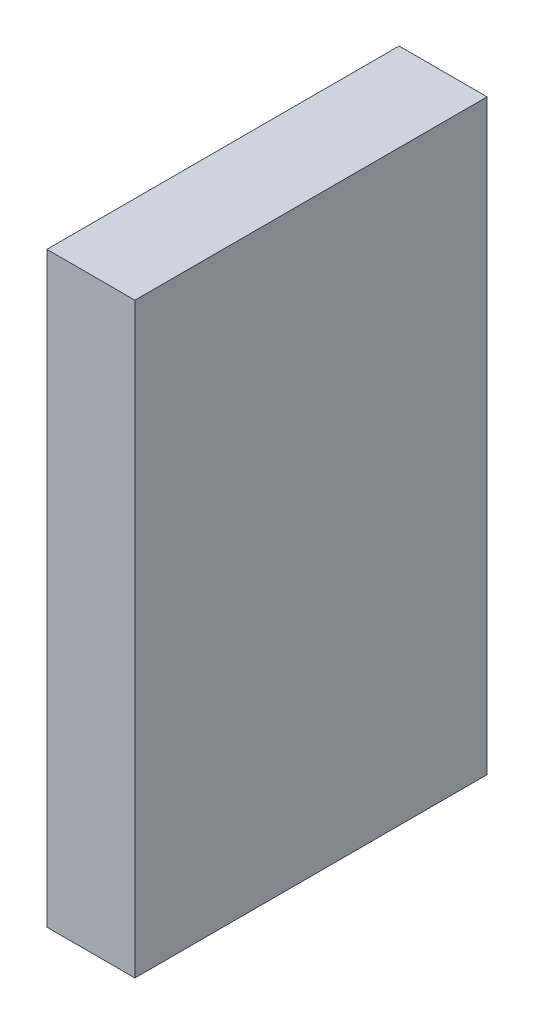
ISO-10303-21;
HEADER;
FILE_DESCRIPTION(('STEP AP214'),'2;1');
FILE_NAME('part.step','',(''),(''),'','','');
FILE_SCHEMA(('AUTOMOTIVE_DESIGN { 1 0 10303 214 1 1 1 1 }'));
ENDSEC;
DATA;
#1=APPLICATION_CONTEXT('core data for automotive mechanical design processes');
#2=APPLICATION_PROTOCOL_DEFINITION('international standard','automotive_design',2000,#1);
#3=PRODUCT_CONTEXT('',#1,'mechanical');
#4=PRODUCT('Part','Part','',(#3));
#5=PRODUCT_RELATED_PRODUCT_CATEGORY('part','',(#4));
#6=PRODUCT_DEFINITION_FORMATION('','',#4);
#7=PRODUCT_DEFINITION_CONTEXT('part definition',#1,'design');
#8=PRODUCT_DEFINITION('design','',#6,#7);
#9=PRODUCT_DEFINITION_SHAPE('','',#8);
#10=(LENGTH_UNIT() NAMED_UNIT(*) SI_UNIT(.MILLI.,.METRE.));
#11=(NAMED_UNIT(*) PLANE_ANGLE_UNIT() SI_UNIT($,.RADIAN.));
#12=(NAMED_UNIT(*) SI_UNIT($,.STERADIAN.) SOLID_ANGLE_UNIT());
#13=UNCERTAINTY_MEASURE_WITH_UNIT(LENGTH_MEASURE(1.E-05),#10,'distance_accuracy_value','');
#14=(GEOMETRIC_REPRESENTATION_CONTEXT(3) GLOBAL_UNCERTAINTY_ASSIGNED_CONTEXT((#13)) GLOBAL_UNIT_ASSIGNED_CONTEXT((#10,
#11,#12)) REPRESENTATION_CONTEXT('',''));
#15=CARTESIAN_POINT('',(0.,0.,0.));
#16=DIRECTION('',(0.,0.,1.));
#17=DIRECTION('',(1.,0.,0.));
#18=AXIS2_PLACEMENT_3D('',#15,#16,#17);
#19=CARTESIAN_POINT('',(0.,0.,60.));
#20=DIRECTION('',(1.,0.,0.));
#21=DIRECTION('',(0.,0.,-1.));
#22=AXIS2_PLACEMENT_3D('',#19,#20,#21);
#23=PLANE('',#22);
#24=DIRECTION('',(0.,-1.,0.));
#25=VECTOR('',#24,1.);
#26=CARTESIAN_POINT('',(0.,0.,0.));
#27=LINE('',#26,#25);
#28=CARTESIAN_POINT('',(0.,100.,0.));
#29=VERTEX_POINT('',#28);
#30=CARTESIAN_POINT('',(0.,0.,0.));
#31=VERTEX_POINT('',#30);
#32=EDGE_CURVE('E100',#29,#31,#27,.T.);
#33=ORIENTED_EDGE('',*,*,#32,.T.);
#34=DIRECTION('',(0.,0.,-1.));
#35=VECTOR('',#34,1.);
#36=CARTESIAN_POINT('',(0.,0.,60.));
#37=LINE('',#36,#35);
#38=CARTESIAN_POINT('',(0.,0.,60.));
#39=VERTEX_POINT('',#38);
#40=EDGE_CURVE('E11',#39,#31,#37,.T.);
#41=ORIENTED_EDGE('',*,*,#40,.F.);
#42=DIRECTION('',(0.,-1.,0.));
#43=VECTOR('',#42,1.);
#44=CARTESIAN_POINT('',(0.,0.,60.));
#45=LINE('',#44,#43);
#46=CARTESIAN_POINT('',(0.,100.,60.));
#47=VERTEX_POINT('',#46);
#48=EDGE_CURVE('E88',#47,#39,#45,.T.);
#49=ORIENTED_EDGE('',*,*,#48,.F.);
#50=DIRECTION('',(0.,0.,-1.));
#51=VECTOR('',#50,1.);
#52=CARTESIAN_POINT('',(0.,100.,60.));
#53=LINE('',#52,#51);
#54=EDGE_CURVE('E96',#47,#29,#53,.T.);
#55=ORIENTED_EDGE('',*,*,#54,.T.);
#56=EDGE_LOOP('',(#33,#41,#49,#55));
#57=FACE_BOUND('',#56,.T.);
#58=ADVANCED_FACE('F37',(#57),#23,.F.);
#59=CARTESIAN_POINT('',(0.,0.,60.));
#60=DIRECTION('',(0.,1.,0.));
#61=DIRECTION('',(0.,0.,1.));
#62=AXIS2_PLACEMENT_3D('',#59,#60,#61);
#63=PLANE('',#62);
#64=DIRECTION('',(1.,0.,0.));
#65=VECTOR('',#64,1.);
#66=CARTESIAN_POINT('',(0.,0.,0.));
#67=LINE('',#66,#65);
#68=CARTESIAN_POINT('',(15.,0.,0.));
#69=VERTEX_POINT('',#68);
#70=EDGE_CURVE('E92',#31,#69,#67,.T.);
#71=ORIENTED_EDGE('',*,*,#70,.T.);
#72=DIRECTION('',(0.,0.,-1.));
#73=VECTOR('',#72,1.);
#74=CARTESIAN_POINT('',(15.,0.,60.));
#75=LINE('',#74,#73);
#76=CARTESIAN_POINT('',(15.,0.,60.));
#77=VERTEX_POINT('',#76);
#78=EDGE_CURVE('E45',#77,#69,#75,.T.);
#79=ORIENTED_EDGE('',*,*,#78,.F.);
#80=DIRECTION('',(1.,0.,0.));
#81=VECTOR('',#80,1.);
#82=CARTESIAN_POINT('',(0.,0.,60.));
#83=LINE('',#82,#81);
#84=EDGE_CURVE('E83',#39,#77,#83,.T.);
#85=ORIENTED_EDGE('',*,*,#84,.F.);
#86=ORIENTED_EDGE('',*,*,#40,.T.);
#87=EDGE_LOOP('',(#71,#79,#85,#86));
#88=FACE_BOUND('',#87,.T.);
#89=ADVANCED_FACE('F91',(#88),#63,.F.);
#90=CARTESIAN_POINT('',(15.,0.,60.));
#91=DIRECTION('',(-1.,0.,0.));
#92=DIRECTION('',(0.,-1.,0.));
#93=AXIS2_PLACEMENT_3D('',#90,#91,#92);
#94=PLANE('',#93);
#95=DIRECTION('',(0.,1.,0.));
#96=VECTOR('',#95,1.);
#97=CARTESIAN_POINT('',(15.,0.,0.));
#98=LINE('',#97,#96);
#99=CARTESIAN_POINT('',(15.,100.,0.));
#100=VERTEX_POINT('',#99);
#101=EDGE_CURVE('E70',#69,#100,#98,.T.);
#102=ORIENTED_EDGE('',*,*,#101,.T.);
#103=DIRECTION('',(0.,0.,-1.));
#104=VECTOR('',#103,1.);
#105=CARTESIAN_POINT('',(15.,100.,60.));
#106=LINE('',#105,#104);
#107=CARTESIAN_POINT('',(15.,100.,60.));
#108=VERTEX_POINT('',#107);
#109=EDGE_CURVE('E93',#108,#100,#106,.T.);
#110=ORIENTED_EDGE('',*,*,#109,.F.);
#111=DIRECTION('',(0.,1.,0.));
#112=VECTOR('',#111,1.);
#113=CARTESIAN_POINT('',(15.,0.,60.));
#114=LINE('',#113,#112);
#115=EDGE_CURVE('E86',#77,#108,#114,.T.);
#116=ORIENTED_EDGE('',*,*,#115,.F.);
#117=ORIENTED_EDGE('',*,*,#78,.T.);
#118=EDGE_LOOP('',(#102,#110,#116,#117));
#119=FACE_BOUND('',#118,.T.);
#120=ADVANCED_FACE('F94',(#119),#94,.F.);
#121=CARTESIAN_POINT('',(0.,100.,60.));
#122=DIRECTION('',(0.,-1.,0.));
#123=DIRECTION('',(0.,0.,-1.));
#124=AXIS2_PLACEMENT_3D('',#121,#122,#123);
#125=PLANE('',#124);
#126=DIRECTION('',(-1.,0.,0.));
#127=VECTOR('',#126,1.);
#128=CARTESIAN_POINT('',(0.,100.,0.));
#129=LINE('',#128,#127);
#130=EDGE_CURVE('E76',#100,#29,#129,.T.);
#131=ORIENTED_EDGE('',*,*,#130,.T.);
#132=ORIENTED_EDGE('',*,*,#54,.F.);
#133=DIRECTION('',(-1.,0.,0.));
#134=VECTOR('',#133,1.);
#135=CARTESIAN_POINT('',(0.,100.,60.));
#136=LINE('',#135,#134);
#137=EDGE_CURVE('E53',#108,#47,#136,.T.);
#138=ORIENTED_EDGE('',*,*,#137,.F.);
#139=ORIENTED_EDGE('',*,*,#109,.T.);
#140=EDGE_LOOP('',(#131,#132,#138,#139));
#141=FACE_BOUND('',#140,.T.);
#142=ADVANCED_FACE('F107',(#141),#125,.F.);
#143=CARTESIAN_POINT('',(0.,100.,60.));
#144=DIRECTION('',(0.,0.,-1.));
#145=DIRECTION('',(-1.,0.,0.));
#146=AXIS2_PLACEMENT_3D('',#143,#144,#145);
#147=PLANE('',#146);
#148=ORIENTED_EDGE('',*,*,#48,.T.);
#149=ORIENTED_EDGE('',*,*,#84,.T.);
#150=ORIENTED_EDGE('',*,*,#115,.T.);
#151=ORIENTED_EDGE('',*,*,#137,.T.);
#152=EDGE_LOOP('',(#148,#149,#150,#151));
#153=FACE_BOUND('',#152,.T.);
#154=ADVANCED_FACE('F84',(#153),#147,.F.);
#155=CARTESIAN_POINT('',(0.,100.,0.));
#156=DIRECTION('',(0.,0.,-1.));
#157=DIRECTION('',(-1.,0.,0.));
#158=AXIS2_PLACEMENT_3D('',#155,#156,#157);
#159=PLANE('',#158);
#160=ORIENTED_EDGE('',*,*,#32,.F.);
#161=ORIENTED_EDGE('',*,*,#130,.F.);
#162=ORIENTED_EDGE('',*,*,#101,.F.);
#163=ORIENTED_EDGE('',*,*,#70,.F.);
#164=EDGE_LOOP('',(#160,#161,#162,#163));
#165=FACE_BOUND('',#164,.T.);
#166=ADVANCED_FACE('F110',(#165),#159,.T.);
#167=CLOSED_SHELL('',(#58,#89,#120,#142,#154,#166));
#168=MANIFOLD_SOLID_BREP('B2',#167);
#169=ADVANCED_BREP_SHAPE_REPRESENTATION('',(#18,#168),#14);
#170=SHAPE_DEFINITION_REPRESENTATION(#9,#169);
ENDSEC;
END-ISO-10303-21;
